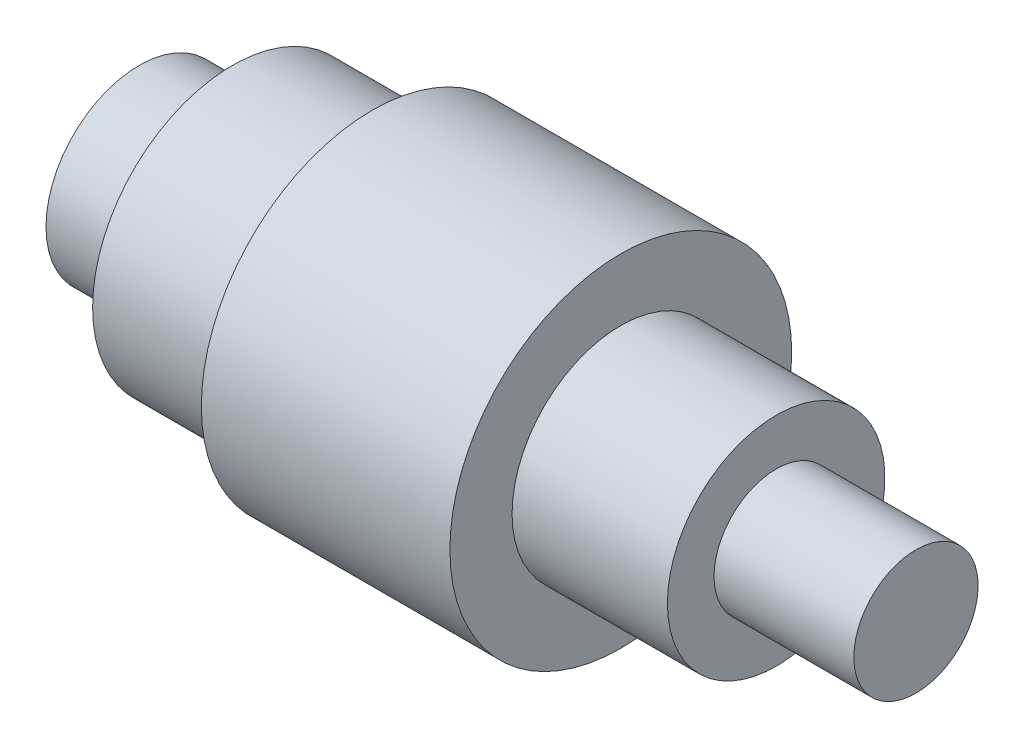
ISO-10303-21;
HEADER;
FILE_DESCRIPTION(('STEP AP214'),'2;1');
FILE_NAME('part.step','',(''),(''),'','','');
FILE_SCHEMA(('AUTOMOTIVE_DESIGN { 1 0 10303 214 1 1 1 1 }'));
ENDSEC;
DATA;
#1=APPLICATION_CONTEXT('core data for automotive mechanical design processes');
#2=APPLICATION_PROTOCOL_DEFINITION('international standard','automotive_design',2000,#1);
#3=PRODUCT_CONTEXT('',#1,'mechanical');
#4=PRODUCT('Part','Part','',(#3));
#5=PRODUCT_RELATED_PRODUCT_CATEGORY('part','',(#4));
#6=PRODUCT_DEFINITION_FORMATION('','',#4);
#7=PRODUCT_DEFINITION_CONTEXT('part definition',#1,'design');
#8=PRODUCT_DEFINITION('design','',#6,#7);
#9=PRODUCT_DEFINITION_SHAPE('','',#8);
#10=(LENGTH_UNIT() NAMED_UNIT(*) SI_UNIT(.MILLI.,.METRE.));
#11=(NAMED_UNIT(*) PLANE_ANGLE_UNIT() SI_UNIT($,.RADIAN.));
#12=(NAMED_UNIT(*) SI_UNIT($,.STERADIAN.) SOLID_ANGLE_UNIT());
#13=UNCERTAINTY_MEASURE_WITH_UNIT(LENGTH_MEASURE(1.E-05),#10,'distance_accuracy_value','');
#14=(GEOMETRIC_REPRESENTATION_CONTEXT(3) GLOBAL_UNCERTAINTY_ASSIGNED_CONTEXT((#13)) GLOBAL_UNIT_ASSIGNED_CONTEXT((#10,
#11,#12)) REPRESENTATION_CONTEXT('',''));
#15=CARTESIAN_POINT('',(0.,0.,0.));
#16=DIRECTION('',(0.,0.,1.));
#17=DIRECTION('',(1.,0.,0.));
#18=AXIS2_PLACEMENT_3D('',#15,#16,#17);
#19=CARTESIAN_POINT('',(0.,0.,0.));
#20=DIRECTION('',(1.,0.,0.));
#21=DIRECTION('',(0.,0.,-1.));
#22=AXIS2_PLACEMENT_3D('',#19,#20,#21);
#23=PLANE('',#22);
#24=CARTESIAN_POINT('',(0.,0.,0.));
#25=DIRECTION('',(-1.,0.,0.));
#26=DIRECTION('',(0.,0.,1.));
#27=AXIS2_PLACEMENT_3D('',#24,#25,#26);
#28=CIRCLE('',#27,30.);
#29=CARTESIAN_POINT('',(0.,0.,30.));
#30=VERTEX_POINT('',#29);
#31=EDGE_CURVE('E10',#30,#30,#28,.T.);
#32=ORIENTED_EDGE('',*,*,#31,.T.);
#33=EDGE_LOOP('',(#32));
#34=FACE_BOUND('',#33,.T.);
#35=ADVANCED_FACE('F43',(#34),#23,.F.);
#36=CARTESIAN_POINT('',(0.,0.,0.));
#37=DIRECTION('',(-1.,0.,0.));
#38=DIRECTION('',(0.,0.,1.));
#39=AXIS2_PLACEMENT_3D('',#36,#37,#38);
#40=CYLINDRICAL_SURFACE('',#39,30.);
#41=ORIENTED_EDGE('',*,*,#31,.F.);
#42=EDGE_LOOP('',(#41));
#43=FACE_BOUND('',#42,.T.);
#44=CARTESIAN_POINT('',(30.,0.,0.));
#45=DIRECTION('',(-1.,0.,0.));
#46=DIRECTION('',(0.,0.,1.));
#47=AXIS2_PLACEMENT_3D('',#44,#45,#46);
#48=CIRCLE('',#47,30.);
#49=CARTESIAN_POINT('',(30.,0.,30.));
#50=VERTEX_POINT('',#49);
#51=EDGE_CURVE('E50',#50,#50,#48,.T.);
#52=ORIENTED_EDGE('',*,*,#51,.T.);
#53=EDGE_LOOP('',(#52));
#54=FACE_BOUND('',#53,.T.);
#55=ADVANCED_FACE('F103',(#43,#54),#40,.T.);
#56=CARTESIAN_POINT('',(30.,30.,0.));
#57=DIRECTION('',(1.,0.,0.));
#58=DIRECTION('',(0.,0.,-1.));
#59=AXIS2_PLACEMENT_3D('',#56,#57,#58);
#60=PLANE('',#59);
#61=ORIENTED_EDGE('',*,*,#51,.F.);
#62=EDGE_LOOP('',(#61));
#63=FACE_BOUND('',#62,.T.);
#64=CARTESIAN_POINT('',(30.,0.,0.));
#65=DIRECTION('',(-1.,0.,0.));
#66=DIRECTION('',(0.,0.,1.));
#67=AXIS2_PLACEMENT_3D('',#64,#65,#66);
#68=CIRCLE('',#67,45.);
#69=CARTESIAN_POINT('',(30.,0.,45.));
#70=VERTEX_POINT('',#69);
#71=EDGE_CURVE('E55',#70,#70,#68,.T.);
#72=ORIENTED_EDGE('',*,*,#71,.T.);
#73=EDGE_LOOP('',(#72));
#74=FACE_BOUND('',#73,.T.);
#75=ADVANCED_FACE('F107',(#63,#74),#60,.F.);
#76=CARTESIAN_POINT('',(0.,0.,0.));
#77=DIRECTION('',(-1.,0.,0.));
#78=DIRECTION('',(0.,0.,1.));
#79=AXIS2_PLACEMENT_3D('',#76,#77,#78);
#80=CYLINDRICAL_SURFACE('',#79,45.);
#81=ORIENTED_EDGE('',*,*,#71,.F.);
#82=EDGE_LOOP('',(#81));
#83=FACE_BOUND('',#82,.T.);
#84=CARTESIAN_POINT('',(75.,0.,0.));
#85=DIRECTION('',(-1.,0.,0.));
#86=DIRECTION('',(0.,0.,1.));
#87=AXIS2_PLACEMENT_3D('',#84,#85,#86);
#88=CIRCLE('',#87,45.);
#89=CARTESIAN_POINT('',(75.,0.,45.));
#90=VERTEX_POINT('',#89);
#91=EDGE_CURVE('E60',#90,#90,#88,.T.);
#92=ORIENTED_EDGE('',*,*,#91,.T.);
#93=EDGE_LOOP('',(#92));
#94=FACE_BOUND('',#93,.T.);
#95=ADVANCED_FACE('F112',(#83,#94),#80,.T.);
#96=CARTESIAN_POINT('',(75.,45.,0.));
#97=DIRECTION('',(1.,0.,0.));
#98=DIRECTION('',(0.,0.,-1.));
#99=AXIS2_PLACEMENT_3D('',#96,#97,#98);
#100=PLANE('',#99);
#101=ORIENTED_EDGE('',*,*,#91,.F.);
#102=EDGE_LOOP('',(#101));
#103=FACE_BOUND('',#102,.T.);
#104=CARTESIAN_POINT('',(75.,0.,0.));
#105=DIRECTION('',(-1.,0.,0.));
#106=DIRECTION('',(0.,0.,1.));
#107=AXIS2_PLACEMENT_3D('',#104,#105,#106);
#108=CIRCLE('',#107,55.);
#109=CARTESIAN_POINT('',(75.,0.,55.));
#110=VERTEX_POINT('',#109);
#111=EDGE_CURVE('E66',#110,#110,#108,.T.);
#112=ORIENTED_EDGE('',*,*,#111,.T.);
#113=EDGE_LOOP('',(#112));
#114=FACE_BOUND('',#113,.T.);
#115=ADVANCED_FACE('F118',(#103,#114),#100,.F.);
#116=CARTESIAN_POINT('',(0.,0.,0.));
#117=DIRECTION('',(-1.,0.,0.));
#118=DIRECTION('',(0.,0.,1.));
#119=AXIS2_PLACEMENT_3D('',#116,#117,#118);
#120=CYLINDRICAL_SURFACE('',#119,55.);
#121=ORIENTED_EDGE('',*,*,#111,.F.);
#122=EDGE_LOOP('',(#121));
#123=FACE_BOUND('',#122,.T.);
#124=CARTESIAN_POINT('',(155.,0.,0.));
#125=DIRECTION('',(-1.,0.,0.));
#126=DIRECTION('',(0.,0.,1.));
#127=AXIS2_PLACEMENT_3D('',#124,#125,#126);
#128=CIRCLE('',#127,55.);
#129=CARTESIAN_POINT('',(155.,0.,55.));
#130=VERTEX_POINT('',#129);
#131=EDGE_CURVE('E70',#130,#130,#128,.T.);
#132=ORIENTED_EDGE('',*,*,#131,.T.);
#133=EDGE_LOOP('',(#132));
#134=FACE_BOUND('',#133,.T.);
#135=ADVANCED_FACE('F122',(#123,#134),#120,.T.);
#136=CARTESIAN_POINT('',(155.,55.,0.));
#137=DIRECTION('',(-1.,0.,0.));
#138=DIRECTION('',(0.,0.,1.));
#139=AXIS2_PLACEMENT_3D('',#136,#137,#138);
#140=PLANE('',#139);
#141=ORIENTED_EDGE('',*,*,#131,.F.);
#142=EDGE_LOOP('',(#141));
#143=FACE_BOUND('',#142,.T.);
#144=CARTESIAN_POINT('',(155.,0.,0.));
#145=DIRECTION('',(-1.,0.,0.));
#146=DIRECTION('',(0.,0.,1.));
#147=AXIS2_PLACEMENT_3D('',#144,#145,#146);
#148=CIRCLE('',#147,35.);
#149=CARTESIAN_POINT('',(155.,0.,35.));
#150=VERTEX_POINT('',#149);
#151=EDGE_CURVE('E74',#150,#150,#148,.T.);
#152=ORIENTED_EDGE('',*,*,#151,.T.);
#153=EDGE_LOOP('',(#152));
#154=FACE_BOUND('',#153,.T.);
#155=ADVANCED_FACE('F126',(#143,#154),#140,.F.);
#156=CARTESIAN_POINT('',(0.,0.,0.));
#157=DIRECTION('',(-1.,0.,0.));
#158=DIRECTION('',(0.,0.,1.));
#159=AXIS2_PLACEMENT_3D('',#156,#157,#158);
#160=CYLINDRICAL_SURFACE('',#159,35.);
#161=ORIENTED_EDGE('',*,*,#151,.F.);
#162=EDGE_LOOP('',(#161));
#163=FACE_BOUND('',#162,.T.);
#164=CARTESIAN_POINT('',(205.,0.,0.));
#165=DIRECTION('',(-1.,0.,0.));
#166=DIRECTION('',(0.,0.,1.));
#167=AXIS2_PLACEMENT_3D('',#164,#165,#166);
#168=CIRCLE('',#167,35.);
#169=CARTESIAN_POINT('',(205.,0.,35.));
#170=VERTEX_POINT('',#169);
#171=EDGE_CURVE('E78',#170,#170,#168,.T.);
#172=ORIENTED_EDGE('',*,*,#171,.T.);
#173=EDGE_LOOP('',(#172));
#174=FACE_BOUND('',#173,.T.);
#175=ADVANCED_FACE('F130',(#163,#174),#160,.T.);
#176=CARTESIAN_POINT('',(205.,35.,0.));
#177=DIRECTION('',(-1.,0.,0.));
#178=DIRECTION('',(0.,0.,1.));
#179=AXIS2_PLACEMENT_3D('',#176,#177,#178);
#180=PLANE('',#179);
#181=ORIENTED_EDGE('',*,*,#171,.F.);
#182=EDGE_LOOP('',(#181));
#183=FACE_BOUND('',#182,.T.);
#184=CARTESIAN_POINT('',(205.,0.,0.));
#185=DIRECTION('',(-1.,0.,0.));
#186=DIRECTION('',(0.,0.,1.));
#187=AXIS2_PLACEMENT_3D('',#184,#185,#186);
#188=CIRCLE('',#187,20.);
#189=CARTESIAN_POINT('',(205.,0.,20.));
#190=VERTEX_POINT('',#189);
#191=EDGE_CURVE('E82',#190,#190,#188,.T.);
#192=ORIENTED_EDGE('',*,*,#191,.T.);
#193=EDGE_LOOP('',(#192));
#194=FACE_BOUND('',#193,.T.);
#195=ADVANCED_FACE('F99',(#183,#194),#180,.F.);
#196=CARTESIAN_POINT('',(0.,0.,0.));
#197=DIRECTION('',(-1.,0.,0.));
#198=DIRECTION('',(0.,0.,1.));
#199=AXIS2_PLACEMENT_3D('',#196,#197,#198);
#200=CYLINDRICAL_SURFACE('',#199,20.);
#201=ORIENTED_EDGE('',*,*,#191,.F.);
#202=EDGE_LOOP('',(#201));
#203=FACE_BOUND('',#202,.T.);
#204=CARTESIAN_POINT('',(250.,0.,0.));
#205=DIRECTION('',(-1.,0.,0.));
#206=DIRECTION('',(0.,0.,1.));
#207=AXIS2_PLACEMENT_3D('',#204,#205,#206);
#208=CIRCLE('',#207,20.);
#209=CARTESIAN_POINT('',(250.,0.,20.));
#210=VERTEX_POINT('',#209);
#211=EDGE_CURVE('E86',#210,#210,#208,.T.);
#212=ORIENTED_EDGE('',*,*,#211,.T.);
#213=EDGE_LOOP('',(#212));
#214=FACE_BOUND('',#213,.T.);
#215=ADVANCED_FACE('F91',(#203,#214),#200,.T.);
#216=CARTESIAN_POINT('',(250.,20.,0.));
#217=DIRECTION('',(-1.,0.,0.));
#218=DIRECTION('',(0.,0.,1.));
#219=AXIS2_PLACEMENT_3D('',#216,#217,#218);
#220=PLANE('',#219);
#221=ORIENTED_EDGE('',*,*,#211,.F.);
#222=EDGE_LOOP('',(#221));
#223=FACE_BOUND('',#222,.T.);
#224=ADVANCED_FACE('F93',(#223),#220,.F.);
#225=CLOSED_SHELL('',(#35,#55,#75,#95,#115,#135,#155,#175,#195,#215,#224));
#226=MANIFOLD_SOLID_BREP('B2',#225);
#227=ADVANCED_BREP_SHAPE_REPRESENTATION('',(#18,#226),#14);
#228=SHAPE_DEFINITION_REPRESENTATION(#9,#227);
ENDSEC;
END-ISO-10303-21;
